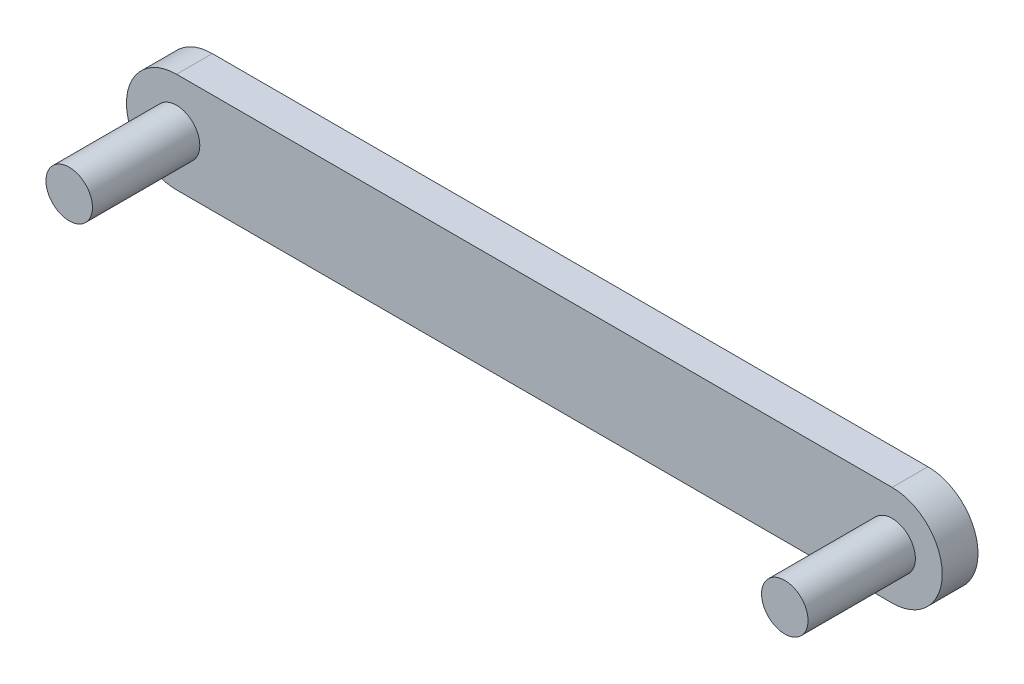
ISO-10303-21;
HEADER;
FILE_DESCRIPTION(('STEP AP214'),'2;1');
FILE_NAME('part.step','',(''),(''),'','','');
FILE_SCHEMA(('AUTOMOTIVE_DESIGN { 1 0 10303 214 1 1 1 1 }'));
ENDSEC;
DATA;
#1=APPLICATION_CONTEXT('core data for automotive mechanical design processes');
#2=APPLICATION_PROTOCOL_DEFINITION('international standard','automotive_design',2000,#1);
#3=PRODUCT_CONTEXT('',#1,'mechanical');
#4=PRODUCT('Part','Part','',(#3));
#5=PRODUCT_RELATED_PRODUCT_CATEGORY('part','',(#4));
#6=PRODUCT_DEFINITION_FORMATION('','',#4);
#7=PRODUCT_DEFINITION_CONTEXT('part definition',#1,'design');
#8=PRODUCT_DEFINITION('design','',#6,#7);
#9=PRODUCT_DEFINITION_SHAPE('','',#8);
#10=(LENGTH_UNIT() NAMED_UNIT(*) SI_UNIT(.MILLI.,.METRE.));
#11=(NAMED_UNIT(*) PLANE_ANGLE_UNIT() SI_UNIT($,.RADIAN.));
#12=(NAMED_UNIT(*) SI_UNIT($,.STERADIAN.) SOLID_ANGLE_UNIT());
#13=UNCERTAINTY_MEASURE_WITH_UNIT(LENGTH_MEASURE(1.E-05),#10,'distance_accuracy_value','');
#14=(GEOMETRIC_REPRESENTATION_CONTEXT(3) GLOBAL_UNCERTAINTY_ASSIGNED_CONTEXT((#13)) GLOBAL_UNIT_ASSIGNED_CONTEXT((#10,
#11,#12)) REPRESENTATION_CONTEXT('',''));
#15=CARTESIAN_POINT('',(0.,0.,0.));
#16=DIRECTION('',(0.,0.,1.));
#17=DIRECTION('',(1.,0.,0.));
#18=AXIS2_PLACEMENT_3D('',#15,#16,#17);
#19=CARTESIAN_POINT('',(100.,0.,10.));
#20=DIRECTION('',(0.,0.,-1.));
#21=DIRECTION('',(-1.,0.,0.));
#22=AXIS2_PLACEMENT_3D('',#19,#20,#21);
#23=CYLINDRICAL_SURFACE('',#22,14.);
#24=CARTESIAN_POINT('',(100.,0.,0.));
#25=DIRECTION('',(0.,0.,1.));
#26=DIRECTION('',(1.,0.,0.));
#27=AXIS2_PLACEMENT_3D('',#24,#25,#26);
#28=CIRCLE('',#27,14.);
#29=CARTESIAN_POINT('',(100.,-14.,0.));
#30=VERTEX_POINT('',#29);
#31=CARTESIAN_POINT('',(100.,14.,0.));
#32=VERTEX_POINT('',#31);
#33=EDGE_CURVE('E96',#30,#32,#28,.T.);
#34=ORIENTED_EDGE('',*,*,#33,.T.);
#35=DIRECTION('',(0.,0.,-1.));
#36=VECTOR('',#35,1.);
#37=CARTESIAN_POINT('',(100.,14.,10.));
#38=LINE('',#37,#36);
#39=CARTESIAN_POINT('',(100.,14.,10.));
#40=VERTEX_POINT('',#39);
#41=EDGE_CURVE('E11',#40,#32,#38,.T.);
#42=ORIENTED_EDGE('',*,*,#41,.F.);
#43=CARTESIAN_POINT('',(100.,0.,10.));
#44=DIRECTION('',(0.,0.,1.));
#45=DIRECTION('',(1.,0.,0.));
#46=AXIS2_PLACEMENT_3D('',#43,#44,#45);
#47=CIRCLE('',#46,14.);
#48=CARTESIAN_POINT('',(100.,-14.,10.));
#49=VERTEX_POINT('',#48);
#50=EDGE_CURVE('E84',#49,#40,#47,.T.);
#51=ORIENTED_EDGE('',*,*,#50,.F.);
#52=DIRECTION('',(0.,0.,-1.));
#53=VECTOR('',#52,1.);
#54=CARTESIAN_POINT('',(100.,-14.,10.));
#55=LINE('',#54,#53);
#56=EDGE_CURVE('E92',#49,#30,#55,.T.);
#57=ORIENTED_EDGE('',*,*,#56,.T.);
#58=EDGE_LOOP('',(#34,#42,#51,#57));
#59=FACE_BOUND('',#58,.T.);
#60=ADVANCED_FACE('F33',(#59),#23,.T.);
#61=CARTESIAN_POINT('',(100.,14.,10.));
#62=DIRECTION('',(0.,-1.,0.));
#63=DIRECTION('',(1.,0.,0.));
#64=AXIS2_PLACEMENT_3D('',#61,#62,#63);
#65=PLANE('',#64);
#66=DIRECTION('',(-1.,0.,0.));
#67=VECTOR('',#66,1.);
#68=CARTESIAN_POINT('',(100.,14.,0.));
#69=LINE('',#68,#67);
#70=CARTESIAN_POINT('',(-100.,14.,0.));
#71=VERTEX_POINT('',#70);
#72=EDGE_CURVE('E88',#32,#71,#69,.T.);
#73=ORIENTED_EDGE('',*,*,#72,.T.);
#74=DIRECTION('',(0.,0.,-1.));
#75=VECTOR('',#74,1.);
#76=CARTESIAN_POINT('',(-100.,14.,10.));
#77=LINE('',#76,#75);
#78=CARTESIAN_POINT('',(-100.,14.,10.));
#79=VERTEX_POINT('',#78);
#80=EDGE_CURVE('E41',#79,#71,#77,.T.);
#81=ORIENTED_EDGE('',*,*,#80,.F.);
#82=DIRECTION('',(-1.,0.,0.));
#83=VECTOR('',#82,1.);
#84=CARTESIAN_POINT('',(100.,14.,10.));
#85=LINE('',#84,#83);
#86=EDGE_CURVE('E79',#40,#79,#85,.T.);
#87=ORIENTED_EDGE('',*,*,#86,.F.);
#88=ORIENTED_EDGE('',*,*,#41,.T.);
#89=EDGE_LOOP('',(#73,#81,#87,#88));
#90=FACE_BOUND('',#89,.T.);
#91=ADVANCED_FACE('F87',(#90),#65,.F.);
#92=CARTESIAN_POINT('',(-100.,0.,10.));
#93=DIRECTION('',(0.,0.,-1.));
#94=DIRECTION('',(-1.,0.,0.));
#95=AXIS2_PLACEMENT_3D('',#92,#93,#94);
#96=CYLINDRICAL_SURFACE('',#95,14.);
#97=CARTESIAN_POINT('',(-100.,0.,0.));
#98=DIRECTION('',(0.,0.,1.));
#99=DIRECTION('',(1.,0.,0.));
#100=AXIS2_PLACEMENT_3D('',#97,#98,#99);
#101=CIRCLE('',#100,14.);
#102=CARTESIAN_POINT('',(-100.,-14.,0.));
#103=VERTEX_POINT('',#102);
#104=EDGE_CURVE('E66',#71,#103,#101,.T.);
#105=ORIENTED_EDGE('',*,*,#104,.T.);
#106=DIRECTION('',(0.,0.,-1.));
#107=VECTOR('',#106,1.);
#108=CARTESIAN_POINT('',(-100.,-14.,10.));
#109=LINE('',#108,#107);
#110=CARTESIAN_POINT('',(-100.,-14.,10.));
#111=VERTEX_POINT('',#110);
#112=EDGE_CURVE('E89',#111,#103,#109,.T.);
#113=ORIENTED_EDGE('',*,*,#112,.F.);
#114=CARTESIAN_POINT('',(-100.,0.,10.));
#115=DIRECTION('',(0.,0.,1.));
#116=DIRECTION('',(1.,0.,0.));
#117=AXIS2_PLACEMENT_3D('',#114,#115,#116);
#118=CIRCLE('',#117,14.);
#119=EDGE_CURVE('E82',#79,#111,#118,.T.);
#120=ORIENTED_EDGE('',*,*,#119,.F.);
#121=ORIENTED_EDGE('',*,*,#80,.T.);
#122=EDGE_LOOP('',(#105,#113,#120,#121));
#123=FACE_BOUND('',#122,.T.);
#124=ADVANCED_FACE('F90',(#123),#96,.T.);
#125=CARTESIAN_POINT('',(100.,-14.,10.));
#126=DIRECTION('',(0.,1.,0.));
#127=DIRECTION('',(-1.,0.,0.));
#128=AXIS2_PLACEMENT_3D('',#125,#126,#127);
#129=PLANE('',#128);
#130=DIRECTION('',(1.,0.,0.));
#131=VECTOR('',#130,1.);
#132=CARTESIAN_POINT('',(100.,-14.,0.));
#133=LINE('',#132,#131);
#134=EDGE_CURVE('E72',#103,#30,#133,.T.);
#135=ORIENTED_EDGE('',*,*,#134,.T.);
#136=ORIENTED_EDGE('',*,*,#56,.F.);
#137=DIRECTION('',(1.,0.,0.));
#138=VECTOR('',#137,1.);
#139=CARTESIAN_POINT('',(100.,-14.,10.));
#140=LINE('',#139,#138);
#141=EDGE_CURVE('E49',#111,#49,#140,.T.);
#142=ORIENTED_EDGE('',*,*,#141,.F.);
#143=ORIENTED_EDGE('',*,*,#112,.T.);
#144=EDGE_LOOP('',(#135,#136,#142,#143));
#145=FACE_BOUND('',#144,.T.);
#146=ADVANCED_FACE('F104',(#145),#129,.F.);
#147=CARTESIAN_POINT('',(100.,0.,10.));
#148=DIRECTION('',(0.,0.,1.));
#149=DIRECTION('',(1.,0.,0.));
#150=AXIS2_PLACEMENT_3D('',#147,#148,#149);
#151=PLANE('',#150);
#152=CARTESIAN_POINT('',(-100.,0.,10.));
#153=DIRECTION('',(0.,0.,1.));
#154=DIRECTION('',(1.,0.,0.));
#155=AXIS2_PLACEMENT_3D('',#152,#153,#154);
#156=CIRCLE('',#155,6.5);
#157=CARTESIAN_POINT('',(-93.5,0.,10.));
#158=VERTEX_POINT('',#157);
#159=EDGE_CURVE('E116',#158,#158,#156,.T.);
#160=ORIENTED_EDGE('',*,*,#159,.F.);
#161=EDGE_LOOP('',(#160));
#162=FACE_BOUND('',#161,.T.);
#163=CARTESIAN_POINT('',(100.,0.,10.));
#164=DIRECTION('',(0.,0.,1.));
#165=DIRECTION('',(1.,0.,0.));
#166=AXIS2_PLACEMENT_3D('',#163,#164,#165);
#167=CIRCLE('',#166,6.5);
#168=CARTESIAN_POINT('',(106.5,0.,10.));
#169=VERTEX_POINT('',#168);
#170=EDGE_CURVE('E110',#169,#169,#167,.T.);
#171=ORIENTED_EDGE('',*,*,#170,.F.);
#172=EDGE_LOOP('',(#171));
#173=FACE_BOUND('',#172,.T.);
#174=ORIENTED_EDGE('',*,*,#50,.T.);
#175=ORIENTED_EDGE('',*,*,#86,.T.);
#176=ORIENTED_EDGE('',*,*,#119,.T.);
#177=ORIENTED_EDGE('',*,*,#141,.T.);
#178=EDGE_LOOP('',(#174,#175,#176,#177));
#179=FACE_BOUND('',#178,.T.);
#180=ADVANCED_FACE('F80',(#162,#173,#179),#151,.T.);
#181=CARTESIAN_POINT('',(100.,0.,0.));
#182=DIRECTION('',(0.,0.,1.));
#183=DIRECTION('',(1.,0.,0.));
#184=AXIS2_PLACEMENT_3D('',#181,#182,#183);
#185=PLANE('',#184);
#186=ORIENTED_EDGE('',*,*,#33,.F.);
#187=ORIENTED_EDGE('',*,*,#134,.F.);
#188=ORIENTED_EDGE('',*,*,#104,.F.);
#189=ORIENTED_EDGE('',*,*,#72,.F.);
#190=EDGE_LOOP('',(#186,#187,#188,#189));
#191=FACE_BOUND('',#190,.T.);
#192=ADVANCED_FACE('F107',(#191),#185,.F.);
#193=CARTESIAN_POINT('',(100.,0.,40.));
#194=DIRECTION('',(0.,0.,-1.));
#195=DIRECTION('',(-1.,0.,0.));
#196=AXIS2_PLACEMENT_3D('',#193,#194,#195);
#197=CYLINDRICAL_SURFACE('',#196,6.5);
#198=CARTESIAN_POINT('',(100.,0.,40.));
#199=DIRECTION('',(0.,0.,1.));
#200=DIRECTION('',(1.,0.,0.));
#201=AXIS2_PLACEMENT_3D('',#198,#199,#200);
#202=CIRCLE('',#201,6.5);
#203=CARTESIAN_POINT('',(106.5,0.,40.));
#204=VERTEX_POINT('',#203);
#205=EDGE_CURVE('E99',#204,#204,#202,.T.);
#206=ORIENTED_EDGE('',*,*,#205,.F.);
#207=EDGE_LOOP('',(#206));
#208=FACE_BOUND('',#207,.T.);
#209=ORIENTED_EDGE('',*,*,#170,.T.);
#210=EDGE_LOOP('',(#209));
#211=FACE_BOUND('',#210,.T.);
#212=ADVANCED_FACE('F136',(#208,#211),#197,.T.);
#213=CARTESIAN_POINT('',(100.,0.,40.));
#214=DIRECTION('',(0.,0.,1.));
#215=DIRECTION('',(1.,0.,0.));
#216=AXIS2_PLACEMENT_3D('',#213,#214,#215);
#217=PLANE('',#216);
#218=ORIENTED_EDGE('',*,*,#205,.T.);
#219=EDGE_LOOP('',(#218));
#220=FACE_BOUND('',#219,.T.);
#221=ADVANCED_FACE('F127',(#220),#217,.T.);
#222=CARTESIAN_POINT('',(-100.,0.,40.));
#223=DIRECTION('',(0.,0.,-1.));
#224=DIRECTION('',(-1.,0.,0.));
#225=AXIS2_PLACEMENT_3D('',#222,#223,#224);
#226=CYLINDRICAL_SURFACE('',#225,6.5);
#227=CARTESIAN_POINT('',(-100.,0.,40.));
#228=DIRECTION('',(0.,0.,1.));
#229=DIRECTION('',(1.,0.,0.));
#230=AXIS2_PLACEMENT_3D('',#227,#228,#229);
#231=CIRCLE('',#230,6.5);
#232=CARTESIAN_POINT('',(-93.5,0.,40.));
#233=VERTEX_POINT('',#232);
#234=EDGE_CURVE('E113',#233,#233,#231,.T.);
#235=ORIENTED_EDGE('',*,*,#234,.F.);
#236=EDGE_LOOP('',(#235));
#237=FACE_BOUND('',#236,.T.);
#238=ORIENTED_EDGE('',*,*,#159,.T.);
#239=EDGE_LOOP('',(#238));
#240=FACE_BOUND('',#239,.T.);
#241=ADVANCED_FACE('F124',(#237,#240),#226,.T.);
#242=CARTESIAN_POINT('',(-100.,0.,40.));
#243=DIRECTION('',(0.,0.,1.));
#244=DIRECTION('',(1.,0.,0.));
#245=AXIS2_PLACEMENT_3D('',#242,#243,#244);
#246=PLANE('',#245);
#247=ORIENTED_EDGE('',*,*,#234,.T.);
#248=EDGE_LOOP('',(#247));
#249=FACE_BOUND('',#248,.T.);
#250=ADVANCED_FACE('F122',(#249),#246,.T.);
#251=CLOSED_SHELL('',(#60,#91,#124,#146,#180,#192,#212,#221,#241,#250));
#252=MANIFOLD_SOLID_BREP('B2',#251);
#253=ADVANCED_BREP_SHAPE_REPRESENTATION('',(#18,#252),#14);
#254=SHAPE_DEFINITION_REPRESENTATION(#9,#253);
ENDSEC;
END-ISO-10303-21;
